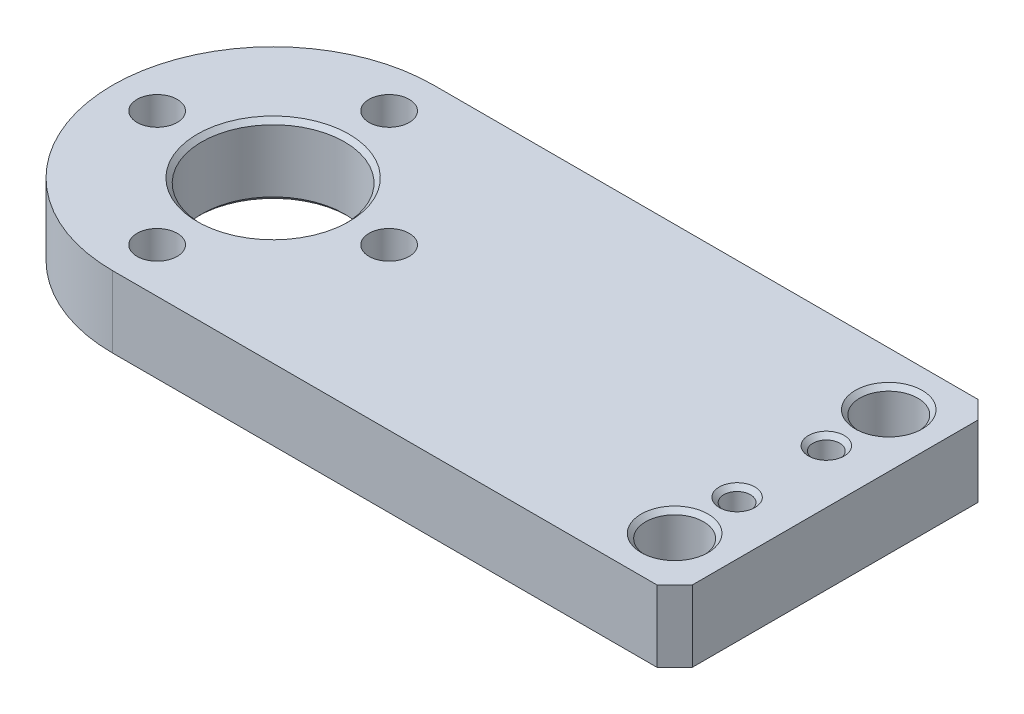
ISO-10303-21;
HEADER;
FILE_DESCRIPTION(('STEP AP214'),'2;1');
FILE_NAME('part.step','',(''),(''),'','','');
FILE_SCHEMA(('AUTOMOTIVE_DESIGN { 1 0 10303 214 1 1 1 1 }'));
ENDSEC;
DATA;
#1=APPLICATION_CONTEXT('core data for automotive mechanical design processes');
#2=APPLICATION_PROTOCOL_DEFINITION('international standard','automotive_design',2000,#1);
#3=PRODUCT_CONTEXT('',#1,'mechanical');
#4=PRODUCT('Part','Part','',(#3));
#5=PRODUCT_RELATED_PRODUCT_CATEGORY('part','',(#4));
#6=PRODUCT_DEFINITION_FORMATION('','',#4);
#7=PRODUCT_DEFINITION_CONTEXT('part definition',#1,'design');
#8=PRODUCT_DEFINITION('design','',#6,#7);
#9=PRODUCT_DEFINITION_SHAPE('','',#8);
#10=(LENGTH_UNIT() NAMED_UNIT(*) SI_UNIT(.MILLI.,.METRE.));
#11=(NAMED_UNIT(*) PLANE_ANGLE_UNIT() SI_UNIT($,.RADIAN.));
#12=(NAMED_UNIT(*) SI_UNIT($,.STERADIAN.) SOLID_ANGLE_UNIT());
#13=UNCERTAINTY_MEASURE_WITH_UNIT(LENGTH_MEASURE(1.E-05),#10,'distance_accuracy_value','');
#14=(GEOMETRIC_REPRESENTATION_CONTEXT(3) GLOBAL_UNCERTAINTY_ASSIGNED_CONTEXT((#13)) GLOBAL_UNIT_ASSIGNED_CONTEXT((#10,
#11,#12)) REPRESENTATION_CONTEXT('',''));
#15=CARTESIAN_POINT('',(0.,0.,0.));
#16=DIRECTION('',(0.,0.,1.));
#17=DIRECTION('',(1.,0.,0.));
#18=AXIS2_PLACEMENT_3D('',#15,#16,#17);
#19=CARTESIAN_POINT('',(0.,8.,-18.));
#20=DIRECTION('',(0.,-1.,0.));
#21=DIRECTION('',(0.,0.,-1.));
#22=AXIS2_PLACEMENT_3D('',#19,#20,#21);
#23=CYLINDRICAL_SURFACE('',#22,18.);
#24=CARTESIAN_POINT('',(0.,0.,-18.));
#25=DIRECTION('',(0.,1.,0.));
#26=DIRECTION('',(0.,0.,-1.));
#27=AXIS2_PLACEMENT_3D('',#24,#25,#26);
#28=CIRCLE('',#27,18.);
#29=CARTESIAN_POINT('',(0.,0.,-36.));
#30=VERTEX_POINT('',#29);
#31=CARTESIAN_POINT('',(0.,0.,0.));
#32=VERTEX_POINT('',#31);
#33=EDGE_CURVE('E117',#30,#32,#28,.T.);
#34=ORIENTED_EDGE('',*,*,#33,.T.);
#35=DIRECTION('',(0.,-1.,0.));
#36=VECTOR('',#35,1.);
#37=CARTESIAN_POINT('',(0.,8.,0.));
#38=LINE('',#37,#36);
#39=CARTESIAN_POINT('',(0.,8.,0.));
#40=VERTEX_POINT('',#39);
#41=EDGE_CURVE('E98',#40,#32,#38,.T.);
#42=ORIENTED_EDGE('',*,*,#41,.F.);
#43=CARTESIAN_POINT('',(0.,8.,-18.));
#44=DIRECTION('',(0.,1.,0.));
#45=DIRECTION('',(0.,0.,-1.));
#46=AXIS2_PLACEMENT_3D('',#43,#44,#45);
#47=CIRCLE('',#46,18.);
#48=CARTESIAN_POINT('',(0.,8.,-36.));
#49=VERTEX_POINT('',#48);
#50=EDGE_CURVE('E104',#49,#40,#47,.T.);
#51=ORIENTED_EDGE('',*,*,#50,.F.);
#52=DIRECTION('',(0.,-1.,0.));
#53=VECTOR('',#52,1.);
#54=CARTESIAN_POINT('',(0.,8.,-36.));
#55=LINE('',#54,#53);
#56=EDGE_CURVE('E120',#49,#30,#55,.T.);
#57=ORIENTED_EDGE('',*,*,#56,.T.);
#58=EDGE_LOOP('',(#34,#42,#51,#57));
#59=FACE_BOUND('',#58,.T.);
#60=ADVANCED_FACE('F40',(#59),#23,.T.);
#61=CARTESIAN_POINT('',(0.,8.,0.));
#62=DIRECTION('',(0.,0.,-1.));
#63=DIRECTION('',(-1.,0.,0.));
#64=AXIS2_PLACEMENT_3D('',#61,#62,#63);
#65=PLANE('',#64);
#66=DIRECTION('',(1.,0.,0.));
#67=VECTOR('',#66,1.);
#68=CARTESIAN_POINT('',(0.,0.,0.));
#69=LINE('',#68,#67);
#70=CARTESIAN_POINT('',(61.,0.,0.));
#71=VERTEX_POINT('',#70);
#72=EDGE_CURVE('E240',#32,#71,#69,.T.);
#73=ORIENTED_EDGE('',*,*,#72,.T.);
#74=DIRECTION('',(0.,1.,0.));
#75=VECTOR('',#74,1.);
#76=CARTESIAN_POINT('',(61.,8.,0.));
#77=LINE('',#76,#75);
#78=CARTESIAN_POINT('',(61.,8.,0.));
#79=VERTEX_POINT('',#78);
#80=EDGE_CURVE('E11',#71,#79,#77,.T.);
#81=ORIENTED_EDGE('',*,*,#80,.T.);
#82=DIRECTION('',(1.,0.,0.));
#83=VECTOR('',#82,1.);
#84=CARTESIAN_POINT('',(0.,8.,0.));
#85=LINE('',#84,#83);
#86=EDGE_CURVE('E94',#40,#79,#85,.T.);
#87=ORIENTED_EDGE('',*,*,#86,.F.);
#88=ORIENTED_EDGE('',*,*,#41,.T.);
#89=EDGE_LOOP('',(#73,#81,#87,#88));
#90=FACE_BOUND('',#89,.T.);
#91=ADVANCED_FACE('F96',(#90),#65,.F.);
#92=CARTESIAN_POINT('',(63.,8.,0.));
#93=DIRECTION('',(-1.,0.,0.));
#94=DIRECTION('',(0.,0.,1.));
#95=AXIS2_PLACEMENT_3D('',#92,#93,#94);
#96=PLANE('',#95);
#97=DIRECTION('',(0.,0.,-1.));
#98=VECTOR('',#97,1.);
#99=CARTESIAN_POINT('',(63.,0.,0.));
#100=LINE('',#99,#98);
#101=CARTESIAN_POINT('',(63.,0.,-2.00000000000002));
#102=VERTEX_POINT('',#101);
#103=CARTESIAN_POINT('',(63.,0.,-34.));
#104=VERTEX_POINT('',#103);
#105=EDGE_CURVE('E236',#102,#104,#100,.T.);
#106=ORIENTED_EDGE('',*,*,#105,.T.);
#107=DIRECTION('',(0.,1.,0.));
#108=VECTOR('',#107,1.);
#109=CARTESIAN_POINT('',(63.,8.,-34.));
#110=LINE('',#109,#108);
#111=CARTESIAN_POINT('',(63.,8.,-34.));
#112=VERTEX_POINT('',#111);
#113=EDGE_CURVE('E63',#104,#112,#110,.T.);
#114=ORIENTED_EDGE('',*,*,#113,.T.);
#115=DIRECTION('',(0.,0.,-1.));
#116=VECTOR('',#115,1.);
#117=CARTESIAN_POINT('',(63.,8.,0.));
#118=LINE('',#117,#116);
#119=CARTESIAN_POINT('',(63.,8.,-2.00000000000002));
#120=VERTEX_POINT('',#119);
#121=EDGE_CURVE('E103',#120,#112,#118,.T.);
#122=ORIENTED_EDGE('',*,*,#121,.F.);
#123=DIRECTION('',(0.,-1.,0.));
#124=VECTOR('',#123,1.);
#125=CARTESIAN_POINT('',(63.,8.,-2.00000000000002));
#126=LINE('',#125,#124);
#127=EDGE_CURVE('E215',#120,#102,#126,.T.);
#128=ORIENTED_EDGE('',*,*,#127,.T.);
#129=EDGE_LOOP('',(#106,#114,#122,#128));
#130=FACE_BOUND('',#129,.T.);
#131=ADVANCED_FACE('F237',(#130),#96,.F.);
#132=CARTESIAN_POINT('',(0.,8.,-36.));
#133=DIRECTION('',(0.,0.,1.));
#134=DIRECTION('',(1.,0.,0.));
#135=AXIS2_PLACEMENT_3D('',#132,#133,#134);
#136=PLANE('',#135);
#137=DIRECTION('',(-1.,0.,0.));
#138=VECTOR('',#137,1.);
#139=CARTESIAN_POINT('',(0.,8.,-36.));
#140=LINE('',#139,#138);
#141=CARTESIAN_POINT('',(61.,8.,-36.));
#142=VERTEX_POINT('',#141);
#143=EDGE_CURVE('E109',#142,#49,#140,.T.);
#144=ORIENTED_EDGE('',*,*,#143,.F.);
#145=DIRECTION('',(0.,-1.,0.));
#146=VECTOR('',#145,1.);
#147=CARTESIAN_POINT('',(61.,8.,-36.));
#148=LINE('',#147,#146);
#149=CARTESIAN_POINT('',(61.,0.,-36.));
#150=VERTEX_POINT('',#149);
#151=EDGE_CURVE('E205',#142,#150,#148,.T.);
#152=ORIENTED_EDGE('',*,*,#151,.T.);
#153=DIRECTION('',(-1.,0.,0.));
#154=VECTOR('',#153,1.);
#155=CARTESIAN_POINT('',(0.,0.,-36.));
#156=LINE('',#155,#154);
#157=EDGE_CURVE('E114',#150,#30,#156,.T.);
#158=ORIENTED_EDGE('',*,*,#157,.T.);
#159=ORIENTED_EDGE('',*,*,#56,.F.);
#160=EDGE_LOOP('',(#144,#152,#158,#159));
#161=FACE_BOUND('',#160,.T.);
#162=ADVANCED_FACE('F228',(#161),#136,.F.);
#163=CARTESIAN_POINT('',(0.,8.,-18.));
#164=DIRECTION('',(0.,-1.,0.));
#165=DIRECTION('',(0.,0.,-1.));
#166=AXIS2_PLACEMENT_3D('',#163,#164,#165);
#167=PLANE('',#166);
#168=CARTESIAN_POINT('',(57.,8.,-6.));
#169=DIRECTION('',(0.,-1.,0.));
#170=DIRECTION('',(0.,0.,-1.));
#171=AXIS2_PLACEMENT_3D('',#168,#169,#170);
#172=CIRCLE('',#171,3.74999999999999);
#173=CARTESIAN_POINT('',(57.,8.,-9.74999999999999));
#174=VERTEX_POINT('',#173);
#175=EDGE_CURVE('E193',#174,#174,#172,.T.);
#176=ORIENTED_EDGE('',*,*,#175,.T.);
#177=EDGE_LOOP('',(#176));
#178=FACE_BOUND('',#177,.T.);
#179=CARTESIAN_POINT('',(57.,8.,-13.));
#180=DIRECTION('',(0.,-1.,0.));
#181=DIRECTION('',(0.,0.,-1.));
#182=AXIS2_PLACEMENT_3D('',#179,#180,#181);
#183=CIRCLE('',#182,2.);
#184=CARTESIAN_POINT('',(57.,8.,-15.));
#185=VERTEX_POINT('',#184);
#186=EDGE_CURVE('E189',#185,#185,#183,.T.);
#187=ORIENTED_EDGE('',*,*,#186,.T.);
#188=EDGE_LOOP('',(#187));
#189=FACE_BOUND('',#188,.T.);
#190=CARTESIAN_POINT('',(57.,8.,-23.));
#191=DIRECTION('',(0.,-1.,0.));
#192=DIRECTION('',(0.,0.,-1.));
#193=AXIS2_PLACEMENT_3D('',#190,#191,#192);
#194=CIRCLE('',#193,2.);
#195=CARTESIAN_POINT('',(57.,8.,-25.));
#196=VERTEX_POINT('',#195);
#197=EDGE_CURVE('E185',#196,#196,#194,.T.);
#198=ORIENTED_EDGE('',*,*,#197,.T.);
#199=EDGE_LOOP('',(#198));
#200=FACE_BOUND('',#199,.T.);
#201=CARTESIAN_POINT('',(57.,8.,-30.));
#202=DIRECTION('',(0.,-1.,0.));
#203=DIRECTION('',(0.,0.,-1.));
#204=AXIS2_PLACEMENT_3D('',#201,#202,#203);
#205=CIRCLE('',#204,3.74999999999999);
#206=CARTESIAN_POINT('',(57.,8.,-33.75));
#207=VERTEX_POINT('',#206);
#208=EDGE_CURVE('E181',#207,#207,#205,.T.);
#209=ORIENTED_EDGE('',*,*,#208,.T.);
#210=EDGE_LOOP('',(#209));
#211=FACE_BOUND('',#210,.T.);
#212=CARTESIAN_POINT('',(0.,8.,-18.));
#213=DIRECTION('',(0.,-1.,0.));
#214=DIRECTION('',(0.,0.,-1.));
#215=AXIS2_PLACEMENT_3D('',#212,#213,#214);
#216=CIRCLE('',#215,8.49999999999999);
#217=CARTESIAN_POINT('',(0.,8.,-26.5));
#218=VERTEX_POINT('',#217);
#219=EDGE_CURVE('E177',#218,#218,#216,.T.);
#220=ORIENTED_EDGE('',*,*,#219,.T.);
#221=EDGE_LOOP('',(#220));
#222=FACE_BOUND('',#221,.T.);
#223=CARTESIAN_POINT('',(0.,8.,-31.));
#224=DIRECTION('',(0.,1.,0.));
#225=DIRECTION('',(0.,0.,1.));
#226=AXIS2_PLACEMENT_3D('',#223,#224,#225);
#227=CIRCLE('',#226,2.25);
#228=CARTESIAN_POINT('',(0.,8.,-28.75));
#229=VERTEX_POINT('',#228);
#230=EDGE_CURVE('E275',#229,#229,#227,.T.);
#231=ORIENTED_EDGE('',*,*,#230,.F.);
#232=EDGE_LOOP('',(#231));
#233=FACE_BOUND('',#232,.T.);
#234=CARTESIAN_POINT('',(13.,8.,-18.));
#235=DIRECTION('',(0.,1.,0.));
#236=DIRECTION('',(0.,0.,1.));
#237=AXIS2_PLACEMENT_3D('',#234,#235,#236);
#238=CIRCLE('',#237,2.25);
#239=CARTESIAN_POINT('',(13.,8.,-15.75));
#240=VERTEX_POINT('',#239);
#241=EDGE_CURVE('E267',#240,#240,#238,.T.);
#242=ORIENTED_EDGE('',*,*,#241,.F.);
#243=EDGE_LOOP('',(#242));
#244=FACE_BOUND('',#243,.T.);
#245=CARTESIAN_POINT('',(0.,8.,-5.));
#246=DIRECTION('',(0.,1.,0.));
#247=DIRECTION('',(0.,0.,1.));
#248=AXIS2_PLACEMENT_3D('',#245,#246,#247);
#249=CIRCLE('',#248,2.25);
#250=CARTESIAN_POINT('',(0.,8.,-2.75));
#251=VERTEX_POINT('',#250);
#252=EDGE_CURVE('E259',#251,#251,#249,.T.);
#253=ORIENTED_EDGE('',*,*,#252,.F.);
#254=EDGE_LOOP('',(#253));
#255=FACE_BOUND('',#254,.T.);
#256=CARTESIAN_POINT('',(-13.,8.,-18.));
#257=DIRECTION('',(0.,1.,0.));
#258=DIRECTION('',(0.,0.,1.));
#259=AXIS2_PLACEMENT_3D('',#256,#257,#258);
#260=CIRCLE('',#259,2.25);
#261=CARTESIAN_POINT('',(-13.,8.,-15.75));
#262=VERTEX_POINT('',#261);
#263=EDGE_CURVE('E251',#262,#262,#260,.T.);
#264=ORIENTED_EDGE('',*,*,#263,.F.);
#265=EDGE_LOOP('',(#264));
#266=FACE_BOUND('',#265,.T.);
#267=ORIENTED_EDGE('',*,*,#121,.T.);
#268=DIRECTION('',(0.707106781186543,0.,0.707106781186552));
#269=VECTOR('',#268,1.);
#270=CARTESIAN_POINT('',(61.,8.,-36.));
#271=LINE('',#270,#269);
#272=EDGE_CURVE('E50',#112,#142,#271,.F.);
#273=ORIENTED_EDGE('',*,*,#272,.T.);
#274=ORIENTED_EDGE('',*,*,#143,.T.);
#275=ORIENTED_EDGE('',*,*,#50,.T.);
#276=ORIENTED_EDGE('',*,*,#86,.T.);
#277=DIRECTION('',(-0.707106781186548,0.,0.707106781186548));
#278=VECTOR('',#277,1.);
#279=CARTESIAN_POINT('',(63.,8.,-2.00000000000002));
#280=LINE('',#279,#278);
#281=EDGE_CURVE('E221',#79,#120,#280,.F.);
#282=ORIENTED_EDGE('',*,*,#281,.T.);
#283=EDGE_LOOP('',(#267,#273,#274,#275,#276,#282));
#284=FACE_BOUND('',#283,.T.);
#285=ADVANCED_FACE('F107',(#178,#189,#200,#211,#222,#233,#244,#255,#266,#284),#167,.F.);
#286=CARTESIAN_POINT('',(0.,0.,-18.));
#287=DIRECTION('',(0.,-1.,0.));
#288=DIRECTION('',(0.,0.,-1.));
#289=AXIS2_PLACEMENT_3D('',#286,#287,#288);
#290=PLANE('',#289);
#291=CARTESIAN_POINT('',(57.,0.,-30.));
#292=DIRECTION('',(0.,-1.,0.));
#293=DIRECTION('',(0.,0.,-1.));
#294=AXIS2_PLACEMENT_3D('',#291,#292,#293);
#295=CIRCLE('',#294,3.75);
#296=CARTESIAN_POINT('',(57.,0.,-33.75));
#297=VERTEX_POINT('',#296);
#298=EDGE_CURVE('E141',#297,#297,#295,.F.);
#299=ORIENTED_EDGE('',*,*,#298,.T.);
#300=EDGE_LOOP('',(#299));
#301=FACE_BOUND('',#300,.T.);
#302=CARTESIAN_POINT('',(57.,0.,-23.));
#303=DIRECTION('',(0.,-1.,0.));
#304=DIRECTION('',(0.,0.,-1.));
#305=AXIS2_PLACEMENT_3D('',#302,#303,#304);
#306=CIRCLE('',#305,1.99999999999999);
#307=CARTESIAN_POINT('',(57.,0.,-25.));
#308=VERTEX_POINT('',#307);
#309=EDGE_CURVE('E137',#308,#308,#306,.F.);
#310=ORIENTED_EDGE('',*,*,#309,.T.);
#311=EDGE_LOOP('',(#310));
#312=FACE_BOUND('',#311,.T.);
#313=CARTESIAN_POINT('',(57.,0.,-13.));
#314=DIRECTION('',(0.,-1.,0.));
#315=DIRECTION('',(0.,0.,-1.));
#316=AXIS2_PLACEMENT_3D('',#313,#314,#315);
#317=CIRCLE('',#316,2.00000000000001);
#318=CARTESIAN_POINT('',(57.,0.,-15.));
#319=VERTEX_POINT('',#318);
#320=EDGE_CURVE('E133',#319,#319,#317,.F.);
#321=ORIENTED_EDGE('',*,*,#320,.T.);
#322=EDGE_LOOP('',(#321));
#323=FACE_BOUND('',#322,.T.);
#324=CARTESIAN_POINT('',(57.,0.,-6.));
#325=DIRECTION('',(0.,-1.,0.));
#326=DIRECTION('',(0.,0.,-1.));
#327=AXIS2_PLACEMENT_3D('',#324,#325,#326);
#328=CIRCLE('',#327,3.75);
#329=CARTESIAN_POINT('',(57.,0.,-9.75));
#330=VERTEX_POINT('',#329);
#331=EDGE_CURVE('E125',#330,#330,#328,.F.);
#332=ORIENTED_EDGE('',*,*,#331,.T.);
#333=EDGE_LOOP('',(#332));
#334=FACE_BOUND('',#333,.T.);
#335=CARTESIAN_POINT('',(0.,0.,-18.));
#336=DIRECTION('',(0.,-1.,0.));
#337=DIRECTION('',(0.,0.,-1.));
#338=AXIS2_PLACEMENT_3D('',#335,#336,#337);
#339=CIRCLE('',#338,8.50000000000001);
#340=CARTESIAN_POINT('',(0.,0.,-26.5));
#341=VERTEX_POINT('',#340);
#342=EDGE_CURVE('E119',#341,#341,#339,.F.);
#343=ORIENTED_EDGE('',*,*,#342,.T.);
#344=EDGE_LOOP('',(#343));
#345=FACE_BOUND('',#344,.T.);
#346=CARTESIAN_POINT('',(0.,0.,-31.));
#347=DIRECTION('',(0.,1.,0.));
#348=DIRECTION('',(0.,0.,1.));
#349=AXIS2_PLACEMENT_3D('',#346,#347,#348);
#350=CIRCLE('',#349,2.25);
#351=CARTESIAN_POINT('',(0.,0.,-28.75));
#352=VERTEX_POINT('',#351);
#353=EDGE_CURVE('E247',#352,#352,#350,.T.);
#354=ORIENTED_EDGE('',*,*,#353,.T.);
#355=EDGE_LOOP('',(#354));
#356=FACE_BOUND('',#355,.T.);
#357=CARTESIAN_POINT('',(13.,0.,-18.));
#358=DIRECTION('',(0.,1.,0.));
#359=DIRECTION('',(0.,0.,1.));
#360=AXIS2_PLACEMENT_3D('',#357,#358,#359);
#361=CIRCLE('',#360,2.25);
#362=CARTESIAN_POINT('',(13.,0.,-15.75));
#363=VERTEX_POINT('',#362);
#364=EDGE_CURVE('E271',#363,#363,#361,.T.);
#365=ORIENTED_EDGE('',*,*,#364,.T.);
#366=EDGE_LOOP('',(#365));
#367=FACE_BOUND('',#366,.T.);
#368=CARTESIAN_POINT('',(0.,0.,-5.));
#369=DIRECTION('',(0.,1.,0.));
#370=DIRECTION('',(0.,0.,1.));
#371=AXIS2_PLACEMENT_3D('',#368,#369,#370);
#372=CIRCLE('',#371,2.25);
#373=CARTESIAN_POINT('',(0.,0.,-2.75));
#374=VERTEX_POINT('',#373);
#375=EDGE_CURVE('E263',#374,#374,#372,.T.);
#376=ORIENTED_EDGE('',*,*,#375,.T.);
#377=EDGE_LOOP('',(#376));
#378=FACE_BOUND('',#377,.T.);
#379=CARTESIAN_POINT('',(-13.,0.,-18.));
#380=DIRECTION('',(0.,1.,0.));
#381=DIRECTION('',(0.,0.,1.));
#382=AXIS2_PLACEMENT_3D('',#379,#380,#381);
#383=CIRCLE('',#382,2.25);
#384=CARTESIAN_POINT('',(-13.,0.,-15.75));
#385=VERTEX_POINT('',#384);
#386=EDGE_CURVE('E255',#385,#385,#383,.T.);
#387=ORIENTED_EDGE('',*,*,#386,.T.);
#388=EDGE_LOOP('',(#387));
#389=FACE_BOUND('',#388,.T.);
#390=ORIENTED_EDGE('',*,*,#157,.F.);
#391=DIRECTION('',(-0.707106781186543,0.,-0.707106781186552));
#392=VECTOR('',#391,1.);
#393=CARTESIAN_POINT('',(39.5000000000004,0.,-57.4999999999999));
#394=LINE('',#393,#392);
#395=EDGE_CURVE('E212',#150,#104,#394,.F.);
#396=ORIENTED_EDGE('',*,*,#395,.T.);
#397=ORIENTED_EDGE('',*,*,#105,.F.);
#398=DIRECTION('',(0.707106781186548,0.,-0.707106781186548));
#399=VECTOR('',#398,1.);
#400=CARTESIAN_POINT('',(39.5,0.,21.5));
#401=LINE('',#400,#399);
#402=EDGE_CURVE('E209',#102,#71,#401,.F.);
#403=ORIENTED_EDGE('',*,*,#402,.T.);
#404=ORIENTED_EDGE('',*,*,#72,.F.);
#405=ORIENTED_EDGE('',*,*,#33,.F.);
#406=EDGE_LOOP('',(#390,#396,#397,#403,#404,#405));
#407=FACE_BOUND('',#406,.T.);
#408=ADVANCED_FACE('F235',(#301,#312,#323,#334,#345,#356,#367,#378,#389,#407),#290,.T.);
#409=CARTESIAN_POINT('',(0.,0.,-18.));
#410=DIRECTION('',(0.,1.,0.));
#411=DIRECTION('',(0.,0.,1.));
#412=AXIS2_PLACEMENT_3D('',#409,#410,#411);
#413=CYLINDRICAL_SURFACE('',#412,8.);
#414=CARTESIAN_POINT('',(0.,0.500000000000021,-18.));
#415=DIRECTION('',(0.,-1.,0.));
#416=DIRECTION('',(0.,0.,-1.));
#417=AXIS2_PLACEMENT_3D('',#414,#415,#416);
#418=CIRCLE('',#417,8.);
#419=CARTESIAN_POINT('',(0.,0.500000000000021,-26.));
#420=VERTEX_POINT('',#419);
#421=EDGE_CURVE('E201',#420,#420,#418,.T.);
#422=ORIENTED_EDGE('',*,*,#421,.T.);
#423=EDGE_LOOP('',(#422));
#424=FACE_BOUND('',#423,.T.);
#425=CARTESIAN_POINT('',(0.,7.50000000000001,-18.));
#426=DIRECTION('',(0.,-1.,0.));
#427=DIRECTION('',(0.,0.,-1.));
#428=AXIS2_PLACEMENT_3D('',#425,#426,#427);
#429=CIRCLE('',#428,8.);
#430=CARTESIAN_POINT('',(0.,7.50000000000001,-26.));
#431=VERTEX_POINT('',#430);
#432=EDGE_CURVE('E197',#431,#431,#429,.F.);
#433=ORIENTED_EDGE('',*,*,#432,.T.);
#434=EDGE_LOOP('',(#433));
#435=FACE_BOUND('',#434,.T.);
#436=ADVANCED_FACE('F419',(#424,#435),#413,.F.);
#437=CARTESIAN_POINT('',(57.,0.,-6.));
#438=DIRECTION('',(0.,1.,0.));
#439=DIRECTION('',(0.,0.,1.));
#440=AXIS2_PLACEMENT_3D('',#437,#438,#439);
#441=CYLINDRICAL_SURFACE('',#440,3.25);
#442=CARTESIAN_POINT('',(57.,0.500000000000005,-6.));
#443=DIRECTION('',(0.,-1.,0.));
#444=DIRECTION('',(0.,0.,-1.));
#445=AXIS2_PLACEMENT_3D('',#442,#443,#444);
#446=CIRCLE('',#445,3.25);
#447=CARTESIAN_POINT('',(57.,0.500000000000005,-9.25));
#448=VERTEX_POINT('',#447);
#449=EDGE_CURVE('E173',#448,#448,#446,.T.);
#450=ORIENTED_EDGE('',*,*,#449,.T.);
#451=EDGE_LOOP('',(#450));
#452=FACE_BOUND('',#451,.T.);
#453=CARTESIAN_POINT('',(57.,7.5,-6.));
#454=DIRECTION('',(0.,-1.,0.));
#455=DIRECTION('',(0.,0.,-1.));
#456=AXIS2_PLACEMENT_3D('',#453,#454,#455);
#457=CIRCLE('',#456,3.25);
#458=CARTESIAN_POINT('',(57.,7.5,-9.25));
#459=VERTEX_POINT('',#458);
#460=EDGE_CURVE('E169',#459,#459,#457,.F.);
#461=ORIENTED_EDGE('',*,*,#460,.T.);
#462=EDGE_LOOP('',(#461));
#463=FACE_BOUND('',#462,.T.);
#464=ADVANCED_FACE('F536',(#452,#463),#441,.F.);
#465=CARTESIAN_POINT('',(57.,0.,-30.));
#466=DIRECTION('',(0.,1.,0.));
#467=DIRECTION('',(0.,0.,1.));
#468=AXIS2_PLACEMENT_3D('',#465,#466,#467);
#469=CYLINDRICAL_SURFACE('',#468,3.25);
#470=CARTESIAN_POINT('',(57.,0.499999999999999,-30.));
#471=DIRECTION('',(0.,-1.,0.));
#472=DIRECTION('',(0.,0.,-1.));
#473=AXIS2_PLACEMENT_3D('',#470,#471,#472);
#474=CIRCLE('',#473,3.25);
#475=CARTESIAN_POINT('',(57.,0.499999999999999,-33.25));
#476=VERTEX_POINT('',#475);
#477=EDGE_CURVE('E149',#476,#476,#474,.T.);
#478=ORIENTED_EDGE('',*,*,#477,.T.);
#479=EDGE_LOOP('',(#478));
#480=FACE_BOUND('',#479,.T.);
#481=CARTESIAN_POINT('',(57.,7.5,-30.));
#482=DIRECTION('',(0.,-1.,0.));
#483=DIRECTION('',(0.,0.,-1.));
#484=AXIS2_PLACEMENT_3D('',#481,#482,#483);
#485=CIRCLE('',#484,3.25);
#486=CARTESIAN_POINT('',(57.,7.5,-33.25));
#487=VERTEX_POINT('',#486);
#488=EDGE_CURVE('E145',#487,#487,#485,.F.);
#489=ORIENTED_EDGE('',*,*,#488,.T.);
#490=EDGE_LOOP('',(#489));
#491=FACE_BOUND('',#490,.T.);
#492=ADVANCED_FACE('F526',(#480,#491),#469,.F.);
#493=CARTESIAN_POINT('',(57.,0.,-13.));
#494=DIRECTION('',(0.,1.,0.));
#495=DIRECTION('',(0.,0.,1.));
#496=AXIS2_PLACEMENT_3D('',#493,#494,#495);
#497=CYLINDRICAL_SURFACE('',#496,1.5);
#498=CARTESIAN_POINT('',(57.,0.500000000000006,-13.));
#499=DIRECTION('',(0.,-1.,0.));
#500=DIRECTION('',(0.,0.,-1.));
#501=AXIS2_PLACEMENT_3D('',#498,#499,#500);
#502=CIRCLE('',#501,1.5);
#503=CARTESIAN_POINT('',(57.,0.500000000000006,-14.5));
#504=VERTEX_POINT('',#503);
#505=EDGE_CURVE('E165',#504,#504,#502,.T.);
#506=ORIENTED_EDGE('',*,*,#505,.T.);
#507=EDGE_LOOP('',(#506));
#508=FACE_BOUND('',#507,.T.);
#509=CARTESIAN_POINT('',(57.,7.5,-13.));
#510=DIRECTION('',(0.,-1.,0.));
#511=DIRECTION('',(0.,0.,-1.));
#512=AXIS2_PLACEMENT_3D('',#509,#510,#511);
#513=CIRCLE('',#512,1.5);
#514=CARTESIAN_POINT('',(57.,7.5,-14.5));
#515=VERTEX_POINT('',#514);
#516=EDGE_CURVE('E161',#515,#515,#513,.F.);
#517=ORIENTED_EDGE('',*,*,#516,.T.);
#518=EDGE_LOOP('',(#517));
#519=FACE_BOUND('',#518,.T.);
#520=ADVANCED_FACE('F315',(#508,#519),#497,.F.);
#521=CARTESIAN_POINT('',(57.,0.,-23.));
#522=DIRECTION('',(0.,1.,0.));
#523=DIRECTION('',(0.,0.,1.));
#524=AXIS2_PLACEMENT_3D('',#521,#522,#523);
#525=CYLINDRICAL_SURFACE('',#524,1.5);
#526=CARTESIAN_POINT('',(57.,0.50000000000001,-23.));
#527=DIRECTION('',(0.,-1.,0.));
#528=DIRECTION('',(0.,0.,-1.));
#529=AXIS2_PLACEMENT_3D('',#526,#527,#528);
#530=CIRCLE('',#529,1.5);
#531=CARTESIAN_POINT('',(57.,0.50000000000001,-24.5));
#532=VERTEX_POINT('',#531);
#533=EDGE_CURVE('E157',#532,#532,#530,.T.);
#534=ORIENTED_EDGE('',*,*,#533,.T.);
#535=EDGE_LOOP('',(#534));
#536=FACE_BOUND('',#535,.T.);
#537=CARTESIAN_POINT('',(57.,7.5,-23.));
#538=DIRECTION('',(0.,-1.,0.));
#539=DIRECTION('',(0.,0.,-1.));
#540=AXIS2_PLACEMENT_3D('',#537,#538,#539);
#541=CIRCLE('',#540,1.5);
#542=CARTESIAN_POINT('',(57.,7.5,-24.5));
#543=VERTEX_POINT('',#542);
#544=EDGE_CURVE('E153',#543,#543,#541,.F.);
#545=ORIENTED_EDGE('',*,*,#544,.T.);
#546=EDGE_LOOP('',(#545));
#547=FACE_BOUND('',#546,.T.);
#548=ADVANCED_FACE('F306',(#536,#547),#525,.F.);
#549=CARTESIAN_POINT('',(-13.,0.,-18.));
#550=DIRECTION('',(0.,1.,0.));
#551=DIRECTION('',(0.,0.,1.));
#552=AXIS2_PLACEMENT_3D('',#549,#550,#551);
#553=CYLINDRICAL_SURFACE('',#552,2.25);
#554=ORIENTED_EDGE('',*,*,#386,.F.);
#555=EDGE_LOOP('',(#554));
#556=FACE_BOUND('',#555,.T.);
#557=ORIENTED_EDGE('',*,*,#263,.T.);
#558=EDGE_LOOP('',(#557));
#559=FACE_BOUND('',#558,.T.);
#560=ADVANCED_FACE('F303',(#556,#559),#553,.F.);
#561=CARTESIAN_POINT('',(0.,0.,-5.));
#562=DIRECTION('',(0.,1.,0.));
#563=DIRECTION('',(0.,0.,1.));
#564=AXIS2_PLACEMENT_3D('',#561,#562,#563);
#565=CYLINDRICAL_SURFACE('',#564,2.25);
#566=ORIENTED_EDGE('',*,*,#375,.F.);
#567=EDGE_LOOP('',(#566));
#568=FACE_BOUND('',#567,.T.);
#569=ORIENTED_EDGE('',*,*,#252,.T.);
#570=EDGE_LOOP('',(#569));
#571=FACE_BOUND('',#570,.T.);
#572=ADVANCED_FACE('F305',(#568,#571),#565,.F.);
#573=CARTESIAN_POINT('',(13.,0.,-18.));
#574=DIRECTION('',(0.,1.,0.));
#575=DIRECTION('',(0.,0.,1.));
#576=AXIS2_PLACEMENT_3D('',#573,#574,#575);
#577=CYLINDRICAL_SURFACE('',#576,2.25);
#578=ORIENTED_EDGE('',*,*,#364,.F.);
#579=EDGE_LOOP('',(#578));
#580=FACE_BOUND('',#579,.T.);
#581=ORIENTED_EDGE('',*,*,#241,.T.);
#582=EDGE_LOOP('',(#581));
#583=FACE_BOUND('',#582,.T.);
#584=ADVANCED_FACE('F289',(#580,#583),#577,.F.);
#585=CARTESIAN_POINT('',(0.,0.,-31.));
#586=DIRECTION('',(0.,1.,0.));
#587=DIRECTION('',(0.,0.,1.));
#588=AXIS2_PLACEMENT_3D('',#585,#586,#587);
#589=CYLINDRICAL_SURFACE('',#588,2.25);
#590=ORIENTED_EDGE('',*,*,#353,.F.);
#591=EDGE_LOOP('',(#590));
#592=FACE_BOUND('',#591,.T.);
#593=ORIENTED_EDGE('',*,*,#230,.T.);
#594=EDGE_LOOP('',(#593));
#595=FACE_BOUND('',#594,.T.);
#596=ADVANCED_FACE('F285',(#592,#595),#589,.F.);
#597=CARTESIAN_POINT('',(57.,0.,-30.));
#598=DIRECTION('',(0.,-1.,0.));
#599=DIRECTION('',(0.,0.,-1.));
#600=AXIS2_PLACEMENT_3D('',#597,#598,#599);
#601=CONICAL_SURFACE('',#600,3.75,0.785398163397451);
#602=ORIENTED_EDGE('',*,*,#477,.F.);
#603=EDGE_LOOP('',(#602));
#604=FACE_BOUND('',#603,.T.);
#605=ORIENTED_EDGE('',*,*,#298,.F.);
#606=EDGE_LOOP('',(#605));
#607=FACE_BOUND('',#606,.T.);
#608=ADVANCED_FACE('F288',(#604,#607),#601,.F.);
#609=CARTESIAN_POINT('',(57.,0.,-23.));
#610=DIRECTION('',(0.,-1.,0.));
#611=DIRECTION('',(0.,0.,-1.));
#612=AXIS2_PLACEMENT_3D('',#609,#610,#611);
#613=CONICAL_SURFACE('',#612,1.99999999999999,0.785398163397429);
#614=ORIENTED_EDGE('',*,*,#533,.F.);
#615=EDGE_LOOP('',(#614));
#616=FACE_BOUND('',#615,.T.);
#617=ORIENTED_EDGE('',*,*,#309,.F.);
#618=EDGE_LOOP('',(#617));
#619=FACE_BOUND('',#618,.T.);
#620=ADVANCED_FACE('F333',(#616,#619),#613,.F.);
#621=CARTESIAN_POINT('',(57.,0.,-13.));
#622=DIRECTION('',(0.,-1.,0.));
#623=DIRECTION('',(0.,0.,-1.));
#624=AXIS2_PLACEMENT_3D('',#621,#622,#623);
#625=CONICAL_SURFACE('',#624,2.00000000000001,0.785398163397445);
#626=ORIENTED_EDGE('',*,*,#505,.F.);
#627=EDGE_LOOP('',(#626));
#628=FACE_BOUND('',#627,.T.);
#629=ORIENTED_EDGE('',*,*,#320,.F.);
#630=EDGE_LOOP('',(#629));
#631=FACE_BOUND('',#630,.T.);
#632=ADVANCED_FACE('F340',(#628,#631),#625,.F.);
#633=CARTESIAN_POINT('',(57.,0.,-6.));
#634=DIRECTION('',(0.,-1.,0.));
#635=DIRECTION('',(0.,0.,-1.));
#636=AXIS2_PLACEMENT_3D('',#633,#634,#635);
#637=CONICAL_SURFACE('',#636,3.75,0.785398163397439);
#638=ORIENTED_EDGE('',*,*,#449,.F.);
#639=EDGE_LOOP('',(#638));
#640=FACE_BOUND('',#639,.T.);
#641=ORIENTED_EDGE('',*,*,#331,.F.);
#642=EDGE_LOOP('',(#641));
#643=FACE_BOUND('',#642,.T.);
#644=ADVANCED_FACE('F347',(#640,#643),#637,.F.);
#645=CARTESIAN_POINT('',(57.,7.5,-6.));
#646=DIRECTION('',(0.,1.,0.));
#647=DIRECTION('',(0.,0.,1.));
#648=AXIS2_PLACEMENT_3D('',#645,#646,#647);
#649=CONICAL_SURFACE('',#648,3.25,0.785398163397438);
#650=ORIENTED_EDGE('',*,*,#175,.F.);
#651=EDGE_LOOP('',(#650));
#652=FACE_BOUND('',#651,.T.);
#653=ORIENTED_EDGE('',*,*,#460,.F.);
#654=EDGE_LOOP('',(#653));
#655=FACE_BOUND('',#654,.T.);
#656=ADVANCED_FACE('F354',(#652,#655),#649,.F.);
#657=CARTESIAN_POINT('',(57.,7.5,-13.));
#658=DIRECTION('',(0.,1.,0.));
#659=DIRECTION('',(0.,0.,1.));
#660=AXIS2_PLACEMENT_3D('',#657,#658,#659);
#661=CONICAL_SURFACE('',#660,1.5,0.785398163397441);
#662=ORIENTED_EDGE('',*,*,#186,.F.);
#663=EDGE_LOOP('',(#662));
#664=FACE_BOUND('',#663,.T.);
#665=ORIENTED_EDGE('',*,*,#516,.F.);
#666=EDGE_LOOP('',(#665));
#667=FACE_BOUND('',#666,.T.);
#668=ADVANCED_FACE('F361',(#664,#667),#661,.F.);
#669=CARTESIAN_POINT('',(57.,7.5,-23.));
#670=DIRECTION('',(0.,1.,0.));
#671=DIRECTION('',(0.,0.,1.));
#672=AXIS2_PLACEMENT_3D('',#669,#670,#671);
#673=CONICAL_SURFACE('',#672,1.5,0.785398163397443);
#674=ORIENTED_EDGE('',*,*,#197,.F.);
#675=EDGE_LOOP('',(#674));
#676=FACE_BOUND('',#675,.T.);
#677=ORIENTED_EDGE('',*,*,#544,.F.);
#678=EDGE_LOOP('',(#677));
#679=FACE_BOUND('',#678,.T.);
#680=ADVANCED_FACE('F368',(#676,#679),#673,.F.);
#681=CARTESIAN_POINT('',(57.,7.5,-30.));
#682=DIRECTION('',(0.,1.,0.));
#683=DIRECTION('',(0.,0.,1.));
#684=AXIS2_PLACEMENT_3D('',#681,#682,#683);
#685=CONICAL_SURFACE('',#684,3.25,0.785398163397436);
#686=ORIENTED_EDGE('',*,*,#208,.F.);
#687=EDGE_LOOP('',(#686));
#688=FACE_BOUND('',#687,.T.);
#689=ORIENTED_EDGE('',*,*,#488,.F.);
#690=EDGE_LOOP('',(#689));
#691=FACE_BOUND('',#690,.T.);
#692=ADVANCED_FACE('F375',(#688,#691),#685,.F.);
#693=CARTESIAN_POINT('',(0.,0.,-18.));
#694=DIRECTION('',(0.,-1.,0.));
#695=DIRECTION('',(0.,0.,-1.));
#696=AXIS2_PLACEMENT_3D('',#693,#694,#695);
#697=CONICAL_SURFACE('',#696,8.50000000000001,0.785398163397434);
#698=ORIENTED_EDGE('',*,*,#421,.F.);
#699=EDGE_LOOP('',(#698));
#700=FACE_BOUND('',#699,.T.);
#701=ORIENTED_EDGE('',*,*,#342,.F.);
#702=EDGE_LOOP('',(#701));
#703=FACE_BOUND('',#702,.T.);
#704=ADVANCED_FACE('F382',(#700,#703),#697,.F.);
#705=CARTESIAN_POINT('',(0.,7.50000000000001,-18.));
#706=DIRECTION('',(0.,1.,0.));
#707=DIRECTION('',(0.,0.,1.));
#708=AXIS2_PLACEMENT_3D('',#705,#706,#707);
#709=CONICAL_SURFACE('',#708,8.,0.785398163397448);
#710=ORIENTED_EDGE('',*,*,#219,.F.);
#711=EDGE_LOOP('',(#710));
#712=FACE_BOUND('',#711,.T.);
#713=ORIENTED_EDGE('',*,*,#432,.F.);
#714=EDGE_LOOP('',(#713));
#715=FACE_BOUND('',#714,.T.);
#716=ADVANCED_FACE('F389',(#712,#715),#709,.F.);
#717=CARTESIAN_POINT('',(61.,8.,-36.));
#718=DIRECTION('',(-0.707106781186552,0.,0.707106781186543));
#719=DIRECTION('',(0.,-1.,0.));
#720=AXIS2_PLACEMENT_3D('',#717,#718,#719);
#721=PLANE('',#720);
#722=ORIENTED_EDGE('',*,*,#272,.F.);
#723=ORIENTED_EDGE('',*,*,#113,.F.);
#724=ORIENTED_EDGE('',*,*,#395,.F.);
#725=ORIENTED_EDGE('',*,*,#151,.F.);
#726=EDGE_LOOP('',(#722,#723,#724,#725));
#727=FACE_BOUND('',#726,.T.);
#728=ADVANCED_FACE('F232',(#727),#721,.F.);
#729=CARTESIAN_POINT('',(63.,8.,-2.00000000000002));
#730=DIRECTION('',(-0.707106781186547,0.,-0.707106781186547));
#731=DIRECTION('',(0.,-1.,0.));
#732=AXIS2_PLACEMENT_3D('',#729,#730,#731);
#733=PLANE('',#732);
#734=ORIENTED_EDGE('',*,*,#281,.F.);
#735=ORIENTED_EDGE('',*,*,#80,.F.);
#736=ORIENTED_EDGE('',*,*,#402,.F.);
#737=ORIENTED_EDGE('',*,*,#127,.F.);
#738=EDGE_LOOP('',(#734,#735,#736,#737));
#739=FACE_BOUND('',#738,.T.);
#740=ADVANCED_FACE('F43',(#739),#733,.F.);
#741=CLOSED_SHELL('',(#60,#91,#131,#162,#285,#408,#436,#464,#492,#520,#548,#560,#572,#584,#596,
#608,#620,#632,#644,#656,#668,#680,#692,#704,#716,#728,#740));
#742=MANIFOLD_SOLID_BREP('B2',#741);
#743=ADVANCED_BREP_SHAPE_REPRESENTATION('',(#18,#742),#14);
#744=SHAPE_DEFINITION_REPRESENTATION(#9,#743);
ENDSEC;
END-ISO-10303-21;
